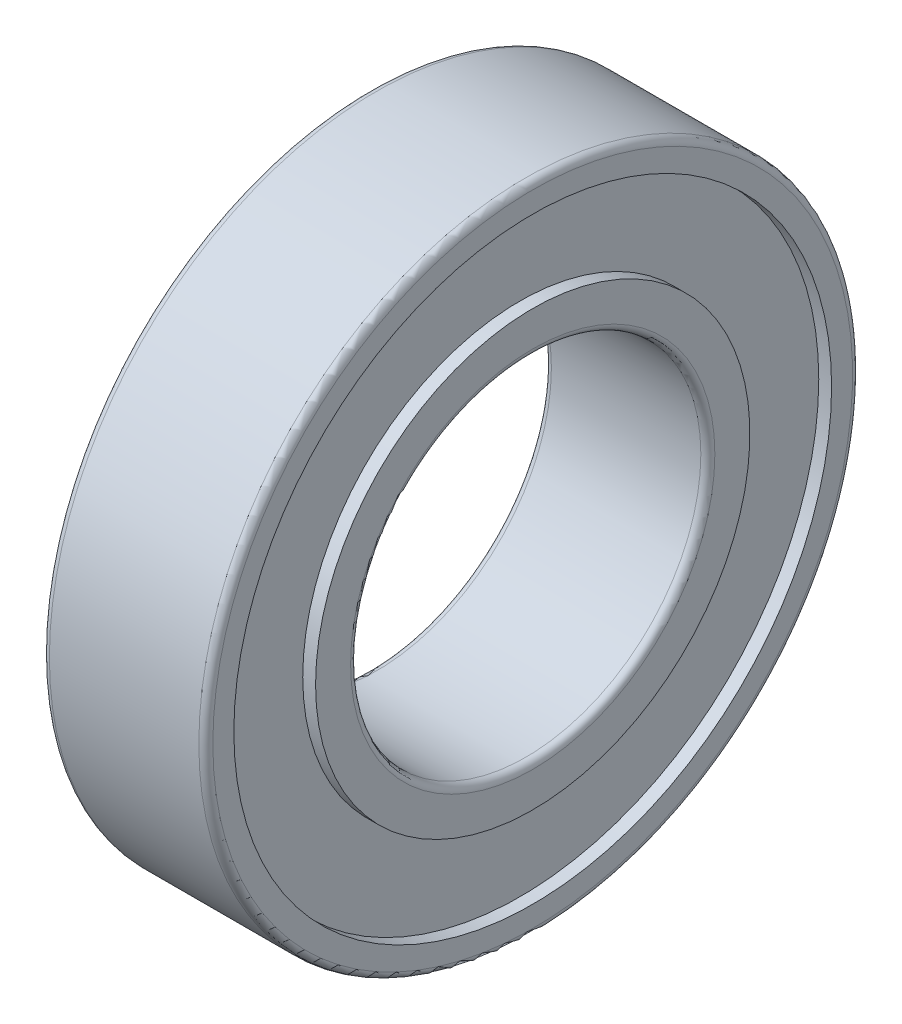
ISO-10303-21;
HEADER;
FILE_DESCRIPTION(('STEP AP214'),'2;1');
FILE_NAME('part.step','',(''),(''),'','','');
FILE_SCHEMA(('AUTOMOTIVE_DESIGN { 1 0 10303 214 1 1 1 1 }'));
ENDSEC;
DATA;
#1=APPLICATION_CONTEXT('core data for automotive mechanical design processes');
#2=APPLICATION_PROTOCOL_DEFINITION('international standard','automotive_design',2000,#1);
#3=PRODUCT_CONTEXT('',#1,'mechanical');
#4=PRODUCT('Part','Part','',(#3));
#5=PRODUCT_RELATED_PRODUCT_CATEGORY('part','',(#4));
#6=PRODUCT_DEFINITION_FORMATION('','',#4);
#7=PRODUCT_DEFINITION_CONTEXT('part definition',#1,'design');
#8=PRODUCT_DEFINITION('design','',#6,#7);
#9=PRODUCT_DEFINITION_SHAPE('','',#8);
#10=(LENGTH_UNIT() NAMED_UNIT(*) SI_UNIT(.MILLI.,.METRE.));
#11=(NAMED_UNIT(*) PLANE_ANGLE_UNIT() SI_UNIT($,.RADIAN.));
#12=(NAMED_UNIT(*) SI_UNIT($,.STERADIAN.) SOLID_ANGLE_UNIT());
#13=UNCERTAINTY_MEASURE_WITH_UNIT(LENGTH_MEASURE(1.E-05),#10,'distance_accuracy_value','');
#14=(GEOMETRIC_REPRESENTATION_CONTEXT(3) GLOBAL_UNCERTAINTY_ASSIGNED_CONTEXT((#13)) GLOBAL_UNIT_ASSIGNED_CONTEXT((#10,
#11,#12)) REPRESENTATION_CONTEXT('',''));
#15=CARTESIAN_POINT('',(0.,0.,0.));
#16=DIRECTION('',(0.,0.,1.));
#17=DIRECTION('',(1.,0.,0.));
#18=AXIS2_PLACEMENT_3D('',#15,#16,#17);
#19=CARTESIAN_POINT('',(0.,-9.55411280622692,-9.3));
#20=DIRECTION('',(-1.,0.,0.));
#21=DIRECTION('',(0.,0.,1.));
#22=AXIS2_PLACEMENT_3D('',#19,#20,#21);
#23=PLANE('',#22);
#24=CARTESIAN_POINT('',(0.,0.,0.));
#25=DIRECTION('',(-1.,0.,0.));
#26=DIRECTION('',(0.,0.,-1.));
#27=AXIS2_PLACEMENT_3D('',#24,#25,#26);
#28=CIRCLE('',#27,9.3);
#29=CARTESIAN_POINT('',(0.,0.,-9.3));
#30=VERTEX_POINT('',#29);
#31=EDGE_CURVE('E68',#30,#30,#28,.F.);
#32=ORIENTED_EDGE('',*,*,#31,.F.);
#33=EDGE_LOOP('',(#32));
#34=FACE_BOUND('',#33,.T.);
#35=CARTESIAN_POINT('',(0.,0.,0.));
#36=DIRECTION('',(1.,0.,0.));
#37=DIRECTION('',(0.,0.,1.));
#38=AXIS2_PLACEMENT_3D('',#35,#36,#37);
#39=CIRCLE('',#38,7.8);
#40=CARTESIAN_POINT('',(0.,0.,7.8));
#41=VERTEX_POINT('',#40);
#42=EDGE_CURVE('E65',#41,#41,#39,.T.);
#43=ORIENTED_EDGE('',*,*,#42,.T.);
#44=EDGE_LOOP('',(#43));
#45=FACE_BOUND('',#44,.T.);
#46=ADVANCED_FACE('F15',(#34,#45),#23,.T.);
#47=CARTESIAN_POINT('',(7.,-9.5541127903656,9.3));
#48=DIRECTION('',(1.,0.,0.));
#49=DIRECTION('',(0.,0.,-1.));
#50=AXIS2_PLACEMENT_3D('',#47,#48,#49);
#51=PLANE('',#50);
#52=CARTESIAN_POINT('',(7.,0.,0.));
#53=DIRECTION('',(1.,0.,0.));
#54=DIRECTION('',(0.,-1.16850949466034E-09,1.));
#55=AXIS2_PLACEMENT_3D('',#52,#53,#54);
#56=CIRCLE('',#55,9.3);
#57=CARTESIAN_POINT('',(7.,-1.08671383003411E-08,9.3));
#58=VERTEX_POINT('',#57);
#59=EDGE_CURVE('E62',#58,#58,#56,.T.);
#60=ORIENTED_EDGE('',*,*,#59,.T.);
#61=EDGE_LOOP('',(#60));
#62=FACE_BOUND('',#61,.T.);
#63=CARTESIAN_POINT('',(7.,0.,0.));
#64=DIRECTION('',(-1.,0.,0.));
#65=DIRECTION('',(0.,0.,-1.));
#66=AXIS2_PLACEMENT_3D('',#63,#64,#65);
#67=CIRCLE('',#66,7.8);
#68=CARTESIAN_POINT('',(7.,0.,-7.8));
#69=VERTEX_POINT('',#68);
#70=EDGE_CURVE('E59',#69,#69,#67,.F.);
#71=ORIENTED_EDGE('',*,*,#70,.F.);
#72=EDGE_LOOP('',(#71));
#73=FACE_BOUND('',#72,.T.);
#74=ADVANCED_FACE('F76',(#62,#73),#51,.T.);
#75=CARTESIAN_POINT('',(6.45,-13.0377771999077,12.8));
#76=DIRECTION('',(1.,0.,0.));
#77=DIRECTION('',(0.,0.,-1.));
#78=AXIS2_PLACEMENT_3D('',#75,#76,#77);
#79=PLANE('',#78);
#80=CARTESIAN_POINT('',(6.45,0.,0.));
#81=DIRECTION('',(1.,0.,0.));
#82=DIRECTION('',(0.,0.,1.));
#83=AXIS2_PLACEMENT_3D('',#80,#81,#82);
#84=CIRCLE('',#83,12.8);
#85=CARTESIAN_POINT('',(6.45,0.,12.8));
#86=VERTEX_POINT('',#85);
#87=EDGE_CURVE('E56',#86,#86,#84,.T.);
#88=ORIENTED_EDGE('',*,*,#87,.T.);
#89=EDGE_LOOP('',(#88));
#90=FACE_BOUND('',#89,.T.);
#91=CARTESIAN_POINT('',(6.45,0.,0.));
#92=DIRECTION('',(-1.,0.,0.));
#93=DIRECTION('',(0.,0.,-1.));
#94=AXIS2_PLACEMENT_3D('',#91,#92,#93);
#95=CIRCLE('',#94,9.3);
#96=CARTESIAN_POINT('',(6.45,0.,-9.3));
#97=VERTEX_POINT('',#96);
#98=EDGE_CURVE('E53',#97,#97,#95,.F.);
#99=ORIENTED_EDGE('',*,*,#98,.F.);
#100=EDGE_LOOP('',(#99));
#101=FACE_BOUND('',#100,.T.);
#102=ADVANCED_FACE('F135',(#90,#101),#79,.T.);
#103=CARTESIAN_POINT('',(7.,-13.9544959092762,13.7));
#104=DIRECTION('',(1.,0.,0.));
#105=DIRECTION('',(0.,0.,-1.));
#106=AXIS2_PLACEMENT_3D('',#103,#104,#105);
#107=PLANE('',#106);
#108=CARTESIAN_POINT('',(7.,0.,0.));
#109=DIRECTION('',(1.,0.,0.));
#110=DIRECTION('',(0.,0.,1.));
#111=AXIS2_PLACEMENT_3D('',#108,#109,#110);
#112=CIRCLE('',#111,13.7);
#113=CARTESIAN_POINT('',(7.,0.,13.7));
#114=VERTEX_POINT('',#113);
#115=EDGE_CURVE('E50',#114,#114,#112,.T.);
#116=ORIENTED_EDGE('',*,*,#115,.T.);
#117=EDGE_LOOP('',(#116));
#118=FACE_BOUND('',#117,.T.);
#119=CARTESIAN_POINT('',(7.,0.,0.));
#120=DIRECTION('',(-1.,0.,0.));
#121=DIRECTION('',(0.,0.,-1.));
#122=AXIS2_PLACEMENT_3D('',#119,#120,#121);
#123=CIRCLE('',#122,12.8);
#124=CARTESIAN_POINT('',(7.,0.,-12.8));
#125=VERTEX_POINT('',#124);
#126=EDGE_CURVE('E47',#125,#125,#123,.F.);
#127=ORIENTED_EDGE('',*,*,#126,.F.);
#128=EDGE_LOOP('',(#127));
#129=FACE_BOUND('',#128,.T.);
#130=ADVANCED_FACE('F130',(#118,#129),#107,.T.);
#131=CARTESIAN_POINT('',(0.,-13.9544959092762,-13.7));
#132=DIRECTION('',(-1.,0.,0.));
#133=DIRECTION('',(0.,0.,1.));
#134=AXIS2_PLACEMENT_3D('',#131,#132,#133);
#135=PLANE('',#134);
#136=CARTESIAN_POINT('',(0.,0.,0.));
#137=DIRECTION('',(-1.,0.,0.));
#138=DIRECTION('',(0.,0.,-1.));
#139=AXIS2_PLACEMENT_3D('',#136,#137,#138);
#140=CIRCLE('',#139,13.7);
#141=CARTESIAN_POINT('',(0.,0.,-13.7));
#142=VERTEX_POINT('',#141);
#143=EDGE_CURVE('E44',#142,#142,#140,.F.);
#144=ORIENTED_EDGE('',*,*,#143,.F.);
#145=EDGE_LOOP('',(#144));
#146=FACE_BOUND('',#145,.T.);
#147=CARTESIAN_POINT('',(0.,0.,0.));
#148=DIRECTION('',(1.,0.,0.));
#149=DIRECTION('',(0.,0.,1.));
#150=AXIS2_PLACEMENT_3D('',#147,#148,#149);
#151=CIRCLE('',#150,12.8);
#152=CARTESIAN_POINT('',(0.,0.,12.8));
#153=VERTEX_POINT('',#152);
#154=EDGE_CURVE('E41',#153,#153,#151,.T.);
#155=ORIENTED_EDGE('',*,*,#154,.T.);
#156=EDGE_LOOP('',(#155));
#157=FACE_BOUND('',#156,.T.);
#158=ADVANCED_FACE('F94',(#146,#157),#135,.T.);
#159=CARTESIAN_POINT('',(0.55,-13.0377771999077,-12.8));
#160=DIRECTION('',(-1.,0.,0.));
#161=DIRECTION('',(0.,0.,1.));
#162=AXIS2_PLACEMENT_3D('',#159,#160,#161);
#163=PLANE('',#162);
#164=CARTESIAN_POINT('',(0.55,0.,0.));
#165=DIRECTION('',(-1.,0.,0.));
#166=DIRECTION('',(0.,0.,-1.));
#167=AXIS2_PLACEMENT_3D('',#164,#165,#166);
#168=CIRCLE('',#167,12.8);
#169=CARTESIAN_POINT('',(0.55,0.,-12.8));
#170=VERTEX_POINT('',#169);
#171=EDGE_CURVE('E38',#170,#170,#168,.F.);
#172=ORIENTED_EDGE('',*,*,#171,.F.);
#173=EDGE_LOOP('',(#172));
#174=FACE_BOUND('',#173,.T.);
#175=CARTESIAN_POINT('',(0.55,0.,0.));
#176=DIRECTION('',(1.,0.,0.));
#177=DIRECTION('',(0.,-1.16835267864258E-09,1.));
#178=AXIS2_PLACEMENT_3D('',#175,#176,#177);
#179=CIRCLE('',#178,9.3);
#180=CARTESIAN_POINT('',(0.55,-1.0865679911376E-08,9.3));
#181=VERTEX_POINT('',#180);
#182=EDGE_CURVE('E35',#181,#181,#179,.T.);
#183=ORIENTED_EDGE('',*,*,#182,.T.);
#184=EDGE_LOOP('',(#183));
#185=FACE_BOUND('',#184,.T.);
#186=ADVANCED_FACE('F83',(#174,#185),#163,.T.);
#187=CARTESIAN_POINT('',(0.299999999999939,0.,0.));
#188=DIRECTION('',(1.,0.,0.));
#189=DIRECTION('',(0.,0.,1.));
#190=AXIS2_PLACEMENT_3D('',#187,#188,#189);
#191=TOROIDAL_SURFACE('',#190,7.8,0.299999999999939);
#192=CARTESIAN_POINT('',(0.3,0.,0.));
#193=DIRECTION('',(1.,0.,0.));
#194=DIRECTION('',(0.,0.,1.));
#195=AXIS2_PLACEMENT_3D('',#192,#193,#194);
#196=CIRCLE('',#195,7.50000000000006);
#197=CARTESIAN_POINT('',(0.3,0.,7.50000000000006));
#198=VERTEX_POINT('',#197);
#199=EDGE_CURVE('E30',#198,#198,#196,.T.);
#200=ORIENTED_EDGE('',*,*,#199,.T.);
#201=EDGE_LOOP('',(#200));
#202=FACE_BOUND('',#201,.T.);
#203=ORIENTED_EDGE('',*,*,#42,.F.);
#204=EDGE_LOOP('',(#203));
#205=FACE_BOUND('',#204,.T.);
#206=ADVANCED_FACE('F80',(#202,#205),#191,.T.);
#207=CARTESIAN_POINT('',(7.,0.,0.));
#208=DIRECTION('',(1.,0.,0.));
#209=DIRECTION('',(0.,0.,1.));
#210=AXIS2_PLACEMENT_3D('',#207,#208,#209);
#211=CYLINDRICAL_SURFACE('',#210,7.5);
#212=CARTESIAN_POINT('',(6.7,0.,0.));
#213=DIRECTION('',(1.,0.,0.));
#214=DIRECTION('',(0.,0.,1.));
#215=AXIS2_PLACEMENT_3D('',#212,#213,#214);
#216=CIRCLE('',#215,7.5);
#217=CARTESIAN_POINT('',(6.7,0.,7.5));
#218=VERTEX_POINT('',#217);
#219=EDGE_CURVE('E26',#218,#218,#216,.T.);
#220=ORIENTED_EDGE('',*,*,#219,.T.);
#221=EDGE_LOOP('',(#220));
#222=FACE_BOUND('',#221,.T.);
#223=ORIENTED_EDGE('',*,*,#199,.F.);
#224=EDGE_LOOP('',(#223));
#225=FACE_BOUND('',#224,.T.);
#226=ADVANCED_FACE('F82',(#222,#225),#211,.F.);
#227=CARTESIAN_POINT('',(6.70000000000012,0.,0.));
#228=DIRECTION('',(1.,0.,0.));
#229=DIRECTION('',(0.,0.,1.));
#230=AXIS2_PLACEMENT_3D('',#227,#228,#229);
#231=TOROIDAL_SURFACE('',#230,7.79999999999988,0.299999999999877);
#232=ORIENTED_EDGE('',*,*,#70,.T.);
#233=EDGE_LOOP('',(#232));
#234=FACE_BOUND('',#233,.T.);
#235=ORIENTED_EDGE('',*,*,#219,.F.);
#236=EDGE_LOOP('',(#235));
#237=FACE_BOUND('',#236,.T.);
#238=ADVANCED_FACE('F91',(#234,#237),#231,.T.);
#239=CARTESIAN_POINT('',(7.,0.,0.));
#240=DIRECTION('',(1.,0.,0.));
#241=DIRECTION('',(0.,0.,1.));
#242=AXIS2_PLACEMENT_3D('',#239,#240,#241);
#243=CYLINDRICAL_SURFACE('',#242,9.3);
#244=ORIENTED_EDGE('',*,*,#98,.T.);
#245=EDGE_LOOP('',(#244));
#246=FACE_BOUND('',#245,.T.);
#247=ORIENTED_EDGE('',*,*,#59,.F.);
#248=EDGE_LOOP('',(#247));
#249=FACE_BOUND('',#248,.T.);
#250=ADVANCED_FACE('F101',(#246,#249),#243,.T.);
#251=CARTESIAN_POINT('',(7.,0.,0.));
#252=DIRECTION('',(1.,0.,0.));
#253=DIRECTION('',(0.,0.,1.));
#254=AXIS2_PLACEMENT_3D('',#251,#252,#253);
#255=CYLINDRICAL_SURFACE('',#254,12.8);
#256=ORIENTED_EDGE('',*,*,#126,.T.);
#257=EDGE_LOOP('',(#256));
#258=FACE_BOUND('',#257,.T.);
#259=ORIENTED_EDGE('',*,*,#87,.F.);
#260=EDGE_LOOP('',(#259));
#261=FACE_BOUND('',#260,.T.);
#262=ADVANCED_FACE('F105',(#258,#261),#255,.F.);
#263=CARTESIAN_POINT('',(6.70000000000012,0.,0.));
#264=DIRECTION('',(1.,0.,0.));
#265=DIRECTION('',(0.,0.,1.));
#266=AXIS2_PLACEMENT_3D('',#263,#264,#265);
#267=TOROIDAL_SURFACE('',#266,13.7000000000001,0.299999999999877);
#268=CARTESIAN_POINT('',(6.70000000000012,0.,0.));
#269=DIRECTION('',(1.,0.,0.));
#270=DIRECTION('',(0.,0.,1.));
#271=AXIS2_PLACEMENT_3D('',#268,#269,#270);
#272=CIRCLE('',#271,14.);
#273=CARTESIAN_POINT('',(6.70000000000012,0.,14.));
#274=VERTEX_POINT('',#273);
#275=EDGE_CURVE('E22',#274,#274,#272,.T.);
#276=ORIENTED_EDGE('',*,*,#275,.T.);
#277=EDGE_LOOP('',(#276));
#278=FACE_BOUND('',#277,.T.);
#279=ORIENTED_EDGE('',*,*,#115,.F.);
#280=EDGE_LOOP('',(#279));
#281=FACE_BOUND('',#280,.T.);
#282=ADVANCED_FACE('F109',(#278,#281),#267,.T.);
#283=CARTESIAN_POINT('',(7.,0.,0.));
#284=DIRECTION('',(1.,0.,0.));
#285=DIRECTION('',(0.,0.,1.));
#286=AXIS2_PLACEMENT_3D('',#283,#284,#285);
#287=CYLINDRICAL_SURFACE('',#286,14.);
#288=CARTESIAN_POINT('',(0.3,0.,0.));
#289=DIRECTION('',(1.,0.,0.));
#290=DIRECTION('',(0.,0.,1.));
#291=AXIS2_PLACEMENT_3D('',#288,#289,#290);
#292=CIRCLE('',#291,14.);
#293=CARTESIAN_POINT('',(0.3,0.,14.));
#294=VERTEX_POINT('',#293);
#295=EDGE_CURVE('E10',#294,#294,#292,.T.);
#296=ORIENTED_EDGE('',*,*,#295,.T.);
#297=EDGE_LOOP('',(#296));
#298=FACE_BOUND('',#297,.T.);
#299=ORIENTED_EDGE('',*,*,#275,.F.);
#300=EDGE_LOOP('',(#299));
#301=FACE_BOUND('',#300,.T.);
#302=ADVANCED_FACE('F113',(#298,#301),#287,.T.);
#303=CARTESIAN_POINT('',(0.299999999999938,0.,0.));
#304=DIRECTION('',(1.,0.,0.));
#305=DIRECTION('',(0.,0.,1.));
#306=AXIS2_PLACEMENT_3D('',#303,#304,#305);
#307=TOROIDAL_SURFACE('',#306,13.7,0.299999999999938);
#308=ORIENTED_EDGE('',*,*,#143,.T.);
#309=EDGE_LOOP('',(#308));
#310=FACE_BOUND('',#309,.T.);
#311=ORIENTED_EDGE('',*,*,#295,.F.);
#312=EDGE_LOOP('',(#311));
#313=FACE_BOUND('',#312,.T.);
#314=ADVANCED_FACE('F116',(#310,#313),#307,.T.);
#315=CARTESIAN_POINT('',(7.,0.,0.));
#316=DIRECTION('',(1.,0.,0.));
#317=DIRECTION('',(0.,0.,1.));
#318=AXIS2_PLACEMENT_3D('',#315,#316,#317);
#319=CYLINDRICAL_SURFACE('',#318,12.8);
#320=ORIENTED_EDGE('',*,*,#171,.T.);
#321=EDGE_LOOP('',(#320));
#322=FACE_BOUND('',#321,.T.);
#323=ORIENTED_EDGE('',*,*,#154,.F.);
#324=EDGE_LOOP('',(#323));
#325=FACE_BOUND('',#324,.T.);
#326=ADVANCED_FACE('F118',(#322,#325),#319,.F.);
#327=CARTESIAN_POINT('',(7.,0.,0.));
#328=DIRECTION('',(1.,0.,0.));
#329=DIRECTION('',(0.,0.,1.));
#330=AXIS2_PLACEMENT_3D('',#327,#328,#329);
#331=CYLINDRICAL_SURFACE('',#330,9.3);
#332=ORIENTED_EDGE('',*,*,#31,.T.);
#333=EDGE_LOOP('',(#332));
#334=FACE_BOUND('',#333,.T.);
#335=ORIENTED_EDGE('',*,*,#182,.F.);
#336=EDGE_LOOP('',(#335));
#337=FACE_BOUND('',#336,.T.);
#338=ADVANCED_FACE('F17',(#334,#337),#331,.T.);
#339=CLOSED_SHELL('',(#46,#74,#102,#130,#158,#186,#206,#226,#238,#250,#262,#282,#302,#314,#326,#338));
#340=MANIFOLD_SOLID_BREP('B1',#339);
#341=ADVANCED_BREP_SHAPE_REPRESENTATION('',(#18,#340),#14);
#342=SHAPE_DEFINITION_REPRESENTATION(#9,#341);
ENDSEC;
END-ISO-10303-21;
